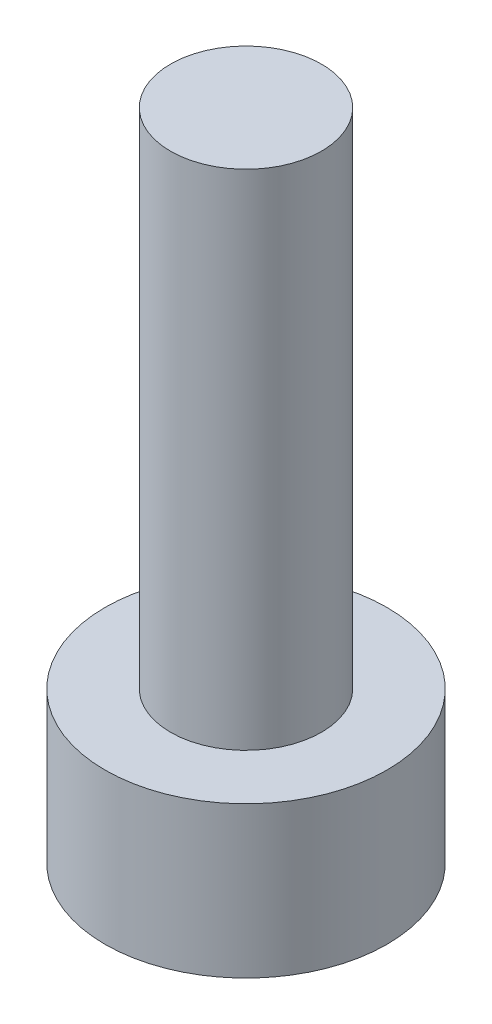
ISO-10303-21;
HEADER;
FILE_DESCRIPTION(('STEP AP214'),'2;1');
FILE_NAME('part.step','',(''),(''),'','','');
FILE_SCHEMA(('AUTOMOTIVE_DESIGN { 1 0 10303 214 1 1 1 1 }'));
ENDSEC;
DATA;
#1=APPLICATION_CONTEXT('core data for automotive mechanical design processes');
#2=APPLICATION_PROTOCOL_DEFINITION('international standard','automotive_design',2000,#1);
#3=PRODUCT_CONTEXT('',#1,'mechanical');
#4=PRODUCT('Part','Part','',(#3));
#5=PRODUCT_RELATED_PRODUCT_CATEGORY('part','',(#4));
#6=PRODUCT_DEFINITION_FORMATION('','',#4);
#7=PRODUCT_DEFINITION_CONTEXT('part definition',#1,'design');
#8=PRODUCT_DEFINITION('design','',#6,#7);
#9=PRODUCT_DEFINITION_SHAPE('','',#8);
#10=(LENGTH_UNIT() NAMED_UNIT(*) SI_UNIT(.MILLI.,.METRE.));
#11=(NAMED_UNIT(*) PLANE_ANGLE_UNIT() SI_UNIT($,.RADIAN.));
#12=(NAMED_UNIT(*) SI_UNIT($,.STERADIAN.) SOLID_ANGLE_UNIT());
#13=UNCERTAINTY_MEASURE_WITH_UNIT(LENGTH_MEASURE(1.E-05),#10,'distance_accuracy_value','');
#14=(GEOMETRIC_REPRESENTATION_CONTEXT(3) GLOBAL_UNCERTAINTY_ASSIGNED_CONTEXT((#13)) GLOBAL_UNIT_ASSIGNED_CONTEXT((#10,
#11,#12)) REPRESENTATION_CONTEXT('',''));
#15=CARTESIAN_POINT('',(0.,0.,0.));
#16=DIRECTION('',(0.,0.,1.));
#17=DIRECTION('',(1.,0.,0.));
#18=AXIS2_PLACEMENT_3D('',#15,#16,#17);
#19=CARTESIAN_POINT('',(0.,3.,0.));
#20=DIRECTION('',(0.,-1.,0.));
#21=DIRECTION('',(0.,0.,-1.));
#22=AXIS2_PLACEMENT_3D('',#19,#20,#21);
#23=CYLINDRICAL_SURFACE('',#22,2.8);
#24=CARTESIAN_POINT('',(0.,3.,0.));
#25=DIRECTION('',(0.,1.,0.));
#26=DIRECTION('',(0.,0.,1.));
#27=AXIS2_PLACEMENT_3D('',#24,#25,#26);
#28=CIRCLE('',#27,2.8);
#29=CARTESIAN_POINT('',(0.,3.,2.8));
#30=VERTEX_POINT('',#29);
#31=EDGE_CURVE('E51',#30,#30,#28,.T.);
#32=ORIENTED_EDGE('',*,*,#31,.F.);
#33=EDGE_LOOP('',(#32));
#34=FACE_BOUND('',#33,.T.);
#35=CARTESIAN_POINT('',(0.,0.,0.));
#36=DIRECTION('',(0.,1.,0.));
#37=DIRECTION('',(0.,0.,1.));
#38=AXIS2_PLACEMENT_3D('',#35,#36,#37);
#39=CIRCLE('',#38,2.8);
#40=CARTESIAN_POINT('',(0.,0.,2.8));
#41=VERTEX_POINT('',#40);
#42=EDGE_CURVE('E46',#41,#41,#39,.T.);
#43=ORIENTED_EDGE('',*,*,#42,.T.);
#44=EDGE_LOOP('',(#43));
#45=FACE_BOUND('',#44,.T.);
#46=ADVANCED_FACE('F43',(#34,#45),#23,.T.);
#47=CARTESIAN_POINT('',(0.,3.,0.));
#48=DIRECTION('',(0.,1.,0.));
#49=DIRECTION('',(0.,0.,1.));
#50=AXIS2_PLACEMENT_3D('',#47,#48,#49);
#51=PLANE('',#50);
#52=CARTESIAN_POINT('',(0.,3.,0.));
#53=DIRECTION('',(0.,1.,0.));
#54=DIRECTION('',(0.,0.,1.));
#55=AXIS2_PLACEMENT_3D('',#52,#53,#54);
#56=CIRCLE('',#55,1.5);
#57=CARTESIAN_POINT('',(0.,3.,1.5));
#58=VERTEX_POINT('',#57);
#59=EDGE_CURVE('E11',#58,#58,#56,.T.);
#60=ORIENTED_EDGE('',*,*,#59,.F.);
#61=EDGE_LOOP('',(#60));
#62=FACE_BOUND('',#61,.T.);
#63=ORIENTED_EDGE('',*,*,#31,.T.);
#64=EDGE_LOOP('',(#63));
#65=FACE_BOUND('',#64,.T.);
#66=ADVANCED_FACE('F162',(#62,#65),#51,.T.);
#67=CARTESIAN_POINT('',(0.,0.,0.));
#68=DIRECTION('',(0.,1.,0.));
#69=DIRECTION('',(0.,0.,1.));
#70=AXIS2_PLACEMENT_3D('',#67,#68,#69);
#71=PLANE('',#70);
#72=DIRECTION('',(0.195712369095071,0.,0.980661342453752));
#73=VECTOR('',#72,1.);
#74=CARTESIAN_POINT('',(1.08458344184122,0.,-0.952371823930755));
#75=LINE('',#74,#73);
#76=CARTESIAN_POINT('',(1.08458344184122,0.,-0.952371823930755));
#77=VERTEX_POINT('',#76);
#78=CARTESIAN_POINT('',(1.36706991429316,0.,0.463090901193079));
#79=VERTEX_POINT('',#78);
#80=EDGE_CURVE('E134',#77,#79,#75,.T.);
#81=ORIENTED_EDGE('',*,*,#80,.F.);
#82=DIRECTION('',(0.947133819621836,0.,0.320838787755708));
#83=VECTOR('',#82,1.);
#84=CARTESIAN_POINT('',(-0.282486472451946,0.,-1.41546272512383));
#85=LINE('',#84,#83);
#86=CARTESIAN_POINT('',(-0.282486472451946,0.,-1.41546272512383));
#87=VERTEX_POINT('',#86);
#88=EDGE_CURVE('E56',#87,#77,#85,.T.);
#89=ORIENTED_EDGE('',*,*,#88,.F.);
#90=DIRECTION('',(0.751421450526765,0.,-0.659822554698044));
#91=VECTOR('',#90,1.);
#92=CARTESIAN_POINT('',(-1.36706991429316,0.,-0.463090901193078));
#93=LINE('',#92,#91);
#94=CARTESIAN_POINT('',(-1.36706991429316,0.,-0.463090901193078));
#95=VERTEX_POINT('',#94);
#96=EDGE_CURVE('E142',#95,#87,#93,.T.);
#97=ORIENTED_EDGE('',*,*,#96,.F.);
#98=DIRECTION('',(-0.195712369095071,0.,-0.980661342453752));
#99=VECTOR('',#98,1.);
#100=CARTESIAN_POINT('',(-1.08458344184122,0.,0.952371823930756));
#101=LINE('',#100,#99);
#102=CARTESIAN_POINT('',(-1.08458344184122,0.,0.952371823930756));
#103=VERTEX_POINT('',#102);
#104=EDGE_CURVE('E139',#103,#95,#101,.T.);
#105=ORIENTED_EDGE('',*,*,#104,.F.);
#106=DIRECTION('',(-0.947133819621836,0.,-0.320838787755708));
#107=VECTOR('',#106,1.);
#108=CARTESIAN_POINT('',(0.282486472451946,0.,1.41546272512383));
#109=LINE('',#108,#107);
#110=CARTESIAN_POINT('',(0.282486472451946,0.,1.41546272512383));
#111=VERTEX_POINT('',#110);
#112=EDGE_CURVE('E110',#111,#103,#109,.T.);
#113=ORIENTED_EDGE('',*,*,#112,.F.);
#114=DIRECTION('',(-0.751421450526765,0.,0.659822554698044));
#115=VECTOR('',#114,1.);
#116=CARTESIAN_POINT('',(1.36706991429316,0.,0.463090901193079));
#117=LINE('',#116,#115);
#118=EDGE_CURVE('E136',#79,#111,#117,.T.);
#119=ORIENTED_EDGE('',*,*,#118,.F.);
#120=EDGE_LOOP('',(#81,#89,#97,#105,#113,#119));
#121=FACE_BOUND('',#120,.T.);
#122=ORIENTED_EDGE('',*,*,#42,.F.);
#123=EDGE_LOOP('',(#122));
#124=FACE_BOUND('',#123,.T.);
#125=ADVANCED_FACE('F159',(#121,#124),#71,.F.);
#126=CARTESIAN_POINT('',(0.,13.,0.));
#127=DIRECTION('',(0.,-1.,0.));
#128=DIRECTION('',(0.,0.,-1.));
#129=AXIS2_PLACEMENT_3D('',#126,#127,#128);
#130=CYLINDRICAL_SURFACE('',#129,1.5);
#131=CARTESIAN_POINT('',(0.,13.,0.));
#132=DIRECTION('',(0.,1.,0.));
#133=DIRECTION('',(0.,0.,1.));
#134=AXIS2_PLACEMENT_3D('',#131,#132,#133);
#135=CIRCLE('',#134,1.5);
#136=CARTESIAN_POINT('',(0.,13.,1.5));
#137=VERTEX_POINT('',#136);
#138=EDGE_CURVE('E148',#137,#137,#135,.T.);
#139=ORIENTED_EDGE('',*,*,#138,.F.);
#140=EDGE_LOOP('',(#139));
#141=FACE_BOUND('',#140,.T.);
#142=ORIENTED_EDGE('',*,*,#59,.T.);
#143=EDGE_LOOP('',(#142));
#144=FACE_BOUND('',#143,.T.);
#145=ADVANCED_FACE('F165',(#141,#144),#130,.T.);
#146=CARTESIAN_POINT('',(0.,13.,0.));
#147=DIRECTION('',(0.,1.,0.));
#148=DIRECTION('',(0.,0.,1.));
#149=AXIS2_PLACEMENT_3D('',#146,#147,#148);
#150=PLANE('',#149);
#151=ORIENTED_EDGE('',*,*,#138,.T.);
#152=EDGE_LOOP('',(#151));
#153=FACE_BOUND('',#152,.T.);
#154=ADVANCED_FACE('F168',(#153),#150,.T.);
#155=CARTESIAN_POINT('',(-0.282486472451946,1.5,-1.41546272512383));
#156=DIRECTION('',(0.320838787755708,0.,-0.947133819621836));
#157=DIRECTION('',(-0.947133819621836,0.,-0.320838787755708));
#158=AXIS2_PLACEMENT_3D('',#155,#156,#157);
#159=PLANE('',#158);
#160=ORIENTED_EDGE('',*,*,#88,.T.);
#161=DIRECTION('',(0.,-1.,0.));
#162=VECTOR('',#161,1.);
#163=CARTESIAN_POINT('',(1.08458344184122,1.5,-0.952371823930755));
#164=LINE('',#163,#162);
#165=CARTESIAN_POINT('',(1.08458344184122,1.5,-0.952371823930755));
#166=VERTEX_POINT('',#165);
#167=EDGE_CURVE('E90',#166,#77,#164,.T.);
#168=ORIENTED_EDGE('',*,*,#167,.F.);
#169=DIRECTION('',(0.947133819621836,0.,0.320838787755708));
#170=VECTOR('',#169,1.);
#171=CARTESIAN_POINT('',(-0.282486472451946,1.5,-1.41546272512383));
#172=LINE('',#171,#170);
#173=CARTESIAN_POINT('',(-0.282486472451946,1.5,-1.41546272512383));
#174=VERTEX_POINT('',#173);
#175=EDGE_CURVE('E145',#174,#166,#172,.T.);
#176=ORIENTED_EDGE('',*,*,#175,.F.);
#177=DIRECTION('',(0.,-1.,0.));
#178=VECTOR('',#177,1.);
#179=CARTESIAN_POINT('',(-0.282486472451946,1.5,-1.41546272512383));
#180=LINE('',#179,#178);
#181=EDGE_CURVE('E70',#174,#87,#180,.T.);
#182=ORIENTED_EDGE('',*,*,#181,.T.);
#183=EDGE_LOOP('',(#160,#168,#176,#182));
#184=FACE_BOUND('',#183,.T.);
#185=ADVANCED_FACE('F196',(#184),#159,.F.);
#186=CARTESIAN_POINT('',(-1.36706991429316,1.5,-0.463090901193078));
#187=DIRECTION('',(-0.659822554698044,0.,-0.751421450526765));
#188=DIRECTION('',(-0.751421450526765,0.,0.659822554698044));
#189=AXIS2_PLACEMENT_3D('',#186,#187,#188);
#190=PLANE('',#189);
#191=ORIENTED_EDGE('',*,*,#96,.T.);
#192=ORIENTED_EDGE('',*,*,#181,.F.);
#193=DIRECTION('',(0.751421450526765,0.,-0.659822554698044));
#194=VECTOR('',#193,1.);
#195=CARTESIAN_POINT('',(-1.36706991429316,1.5,-0.463090901193078));
#196=LINE('',#195,#194);
#197=CARTESIAN_POINT('',(-1.36706991429316,1.5,-0.463090901193078));
#198=VERTEX_POINT('',#197);
#199=EDGE_CURVE('E118',#198,#174,#196,.T.);
#200=ORIENTED_EDGE('',*,*,#199,.F.);
#201=DIRECTION('',(0.,-1.,0.));
#202=VECTOR('',#201,1.);
#203=CARTESIAN_POINT('',(-1.36706991429316,1.5,-0.463090901193078));
#204=LINE('',#203,#202);
#205=EDGE_CURVE('E112',#198,#95,#204,.T.);
#206=ORIENTED_EDGE('',*,*,#205,.T.);
#207=EDGE_LOOP('',(#191,#192,#200,#206));
#208=FACE_BOUND('',#207,.T.);
#209=ADVANCED_FACE('F209',(#208),#190,.F.);
#210=CARTESIAN_POINT('',(-1.08458344184122,1.5,0.952371823930756));
#211=DIRECTION('',(-0.980661342453752,0.,0.195712369095071));
#212=DIRECTION('',(0.195712369095071,0.,0.980661342453752));
#213=AXIS2_PLACEMENT_3D('',#210,#211,#212);
#214=PLANE('',#213);
#215=ORIENTED_EDGE('',*,*,#104,.T.);
#216=ORIENTED_EDGE('',*,*,#205,.F.);
#217=DIRECTION('',(-0.195712369095071,0.,-0.980661342453752));
#218=VECTOR('',#217,1.);
#219=CARTESIAN_POINT('',(-1.08458344184122,1.5,0.952371823930756));
#220=LINE('',#219,#218);
#221=CARTESIAN_POINT('',(-1.08458344184122,1.5,0.952371823930756));
#222=VERTEX_POINT('',#221);
#223=EDGE_CURVE('E113',#222,#198,#220,.T.);
#224=ORIENTED_EDGE('',*,*,#223,.F.);
#225=DIRECTION('',(0.,-1.,0.));
#226=VECTOR('',#225,1.);
#227=CARTESIAN_POINT('',(-1.08458344184122,1.5,0.952371823930756));
#228=LINE('',#227,#226);
#229=EDGE_CURVE('E99',#222,#103,#228,.T.);
#230=ORIENTED_EDGE('',*,*,#229,.T.);
#231=EDGE_LOOP('',(#215,#216,#224,#230));
#232=FACE_BOUND('',#231,.T.);
#233=ADVANCED_FACE('F116',(#232),#214,.F.);
#234=CARTESIAN_POINT('',(0.282486472451946,1.5,1.41546272512383));
#235=DIRECTION('',(-0.320838787755708,0.,0.947133819621836));
#236=DIRECTION('',(0.947133819621836,0.,0.320838787755708));
#237=AXIS2_PLACEMENT_3D('',#234,#235,#236);
#238=PLANE('',#237);
#239=ORIENTED_EDGE('',*,*,#112,.T.);
#240=ORIENTED_EDGE('',*,*,#229,.F.);
#241=DIRECTION('',(-0.947133819621836,0.,-0.320838787755708));
#242=VECTOR('',#241,1.);
#243=CARTESIAN_POINT('',(0.282486472451946,1.5,1.41546272512383));
#244=LINE('',#243,#242);
#245=CARTESIAN_POINT('',(0.282486472451946,1.5,1.41546272512383));
#246=VERTEX_POINT('',#245);
#247=EDGE_CURVE('E102',#246,#222,#244,.T.);
#248=ORIENTED_EDGE('',*,*,#247,.F.);
#249=DIRECTION('',(0.,-1.,0.));
#250=VECTOR('',#249,1.);
#251=CARTESIAN_POINT('',(0.282486472451946,1.5,1.41546272512383));
#252=LINE('',#251,#250);
#253=EDGE_CURVE('E115',#246,#111,#252,.T.);
#254=ORIENTED_EDGE('',*,*,#253,.T.);
#255=EDGE_LOOP('',(#239,#240,#248,#254));
#256=FACE_BOUND('',#255,.T.);
#257=ADVANCED_FACE('F105',(#256),#238,.F.);
#258=CARTESIAN_POINT('',(1.36706991429316,1.5,0.463090901193079));
#259=DIRECTION('',(0.659822554698044,0.,0.751421450526765));
#260=DIRECTION('',(0.751421450526765,0.,-0.659822554698044));
#261=AXIS2_PLACEMENT_3D('',#258,#259,#260);
#262=PLANE('',#261);
#263=ORIENTED_EDGE('',*,*,#118,.T.);
#264=ORIENTED_EDGE('',*,*,#253,.F.);
#265=DIRECTION('',(-0.751421450526765,0.,0.659822554698044));
#266=VECTOR('',#265,1.);
#267=CARTESIAN_POINT('',(1.36706991429316,1.5,0.463090901193079));
#268=LINE('',#267,#266);
#269=CARTESIAN_POINT('',(1.36706991429316,1.5,0.463090901193079));
#270=VERTEX_POINT('',#269);
#271=EDGE_CURVE('E124',#270,#246,#268,.T.);
#272=ORIENTED_EDGE('',*,*,#271,.F.);
#273=DIRECTION('',(0.,-1.,0.));
#274=VECTOR('',#273,1.);
#275=CARTESIAN_POINT('',(1.36706991429316,1.5,0.463090901193079));
#276=LINE('',#275,#274);
#277=EDGE_CURVE('E149',#270,#79,#276,.T.);
#278=ORIENTED_EDGE('',*,*,#277,.T.);
#279=EDGE_LOOP('',(#263,#264,#272,#278));
#280=FACE_BOUND('',#279,.T.);
#281=ADVANCED_FACE('F234',(#280),#262,.F.);
#282=CARTESIAN_POINT('',(1.08458344184122,1.5,-0.952371823930755));
#283=DIRECTION('',(0.980661342453752,0.,-0.195712369095071));
#284=DIRECTION('',(-0.195712369095071,0.,-0.980661342453752));
#285=AXIS2_PLACEMENT_3D('',#282,#283,#284);
#286=PLANE('',#285);
#287=ORIENTED_EDGE('',*,*,#80,.T.);
#288=ORIENTED_EDGE('',*,*,#277,.F.);
#289=DIRECTION('',(0.195712369095071,0.,0.980661342453752));
#290=VECTOR('',#289,1.);
#291=CARTESIAN_POINT('',(1.08458344184122,1.5,-0.952371823930755));
#292=LINE('',#291,#290);
#293=EDGE_CURVE('E130',#166,#270,#292,.T.);
#294=ORIENTED_EDGE('',*,*,#293,.F.);
#295=ORIENTED_EDGE('',*,*,#167,.T.);
#296=EDGE_LOOP('',(#287,#288,#294,#295));
#297=FACE_BOUND('',#296,.T.);
#298=ADVANCED_FACE('F243',(#297),#286,.F.);
#299=CARTESIAN_POINT('',(0.,1.5,0.));
#300=DIRECTION('',(0.,-1.,0.));
#301=DIRECTION('',(0.,0.,-1.));
#302=AXIS2_PLACEMENT_3D('',#299,#300,#301);
#303=PLANE('',#302);
#304=ORIENTED_EDGE('',*,*,#175,.T.);
#305=ORIENTED_EDGE('',*,*,#293,.T.);
#306=ORIENTED_EDGE('',*,*,#271,.T.);
#307=ORIENTED_EDGE('',*,*,#247,.T.);
#308=ORIENTED_EDGE('',*,*,#223,.T.);
#309=ORIENTED_EDGE('',*,*,#199,.T.);
#310=EDGE_LOOP('',(#304,#305,#306,#307,#308,#309));
#311=FACE_BOUND('',#310,.T.);
#312=ADVANCED_FACE('F125',(#311),#303,.T.);
#313=CLOSED_SHELL('',(#46,#66,#125,#145,#154,#185,#209,#233,#257,#281,#298,#312));
#314=MANIFOLD_SOLID_BREP('B2',#313);
#315=ADVANCED_BREP_SHAPE_REPRESENTATION('',(#18,#314),#14);
#316=SHAPE_DEFINITION_REPRESENTATION(#9,#315);
ENDSEC;
END-ISO-10303-21;
